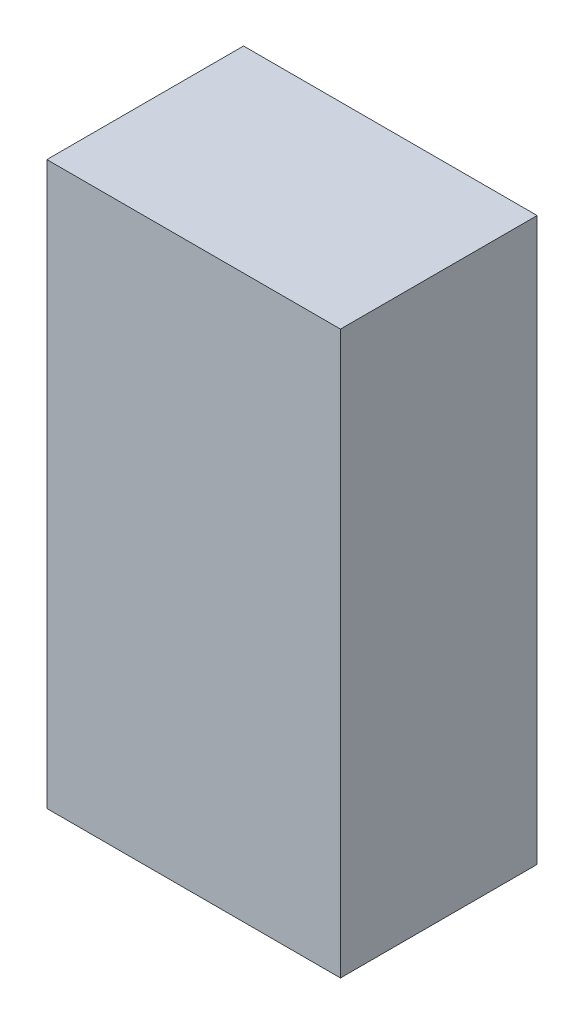
ISO-10303-21;
HEADER;
FILE_DESCRIPTION(('STEP AP214'),'2;1');
FILE_NAME('part.step','',(''),(''),'','','');
FILE_SCHEMA(('AUTOMOTIVE_DESIGN { 1 0 10303 214 1 1 1 1 }'));
ENDSEC;
DATA;
#1=APPLICATION_CONTEXT('core data for automotive mechanical design processes');
#2=APPLICATION_PROTOCOL_DEFINITION('international standard','automotive_design',2000,#1);
#3=PRODUCT_CONTEXT('',#1,'mechanical');
#4=PRODUCT('Part','Part','',(#3));
#5=PRODUCT_RELATED_PRODUCT_CATEGORY('part','',(#4));
#6=PRODUCT_DEFINITION_FORMATION('','',#4);
#7=PRODUCT_DEFINITION_CONTEXT('part definition',#1,'design');
#8=PRODUCT_DEFINITION('design','',#6,#7);
#9=PRODUCT_DEFINITION_SHAPE('','',#8);
#10=(LENGTH_UNIT() NAMED_UNIT(*) SI_UNIT(.MILLI.,.METRE.));
#11=(NAMED_UNIT(*) PLANE_ANGLE_UNIT() SI_UNIT($,.RADIAN.));
#12=(NAMED_UNIT(*) SI_UNIT($,.STERADIAN.) SOLID_ANGLE_UNIT());
#13=UNCERTAINTY_MEASURE_WITH_UNIT(LENGTH_MEASURE(1.E-05),#10,'distance_accuracy_value','');
#14=(GEOMETRIC_REPRESENTATION_CONTEXT(3) GLOBAL_UNCERTAINTY_ASSIGNED_CONTEXT((#13)) GLOBAL_UNIT_ASSIGNED_CONTEXT((#10,
#11,#12)) REPRESENTATION_CONTEXT('',''));
#15=CARTESIAN_POINT('',(0.,0.,0.));
#16=DIRECTION('',(0.,0.,1.));
#17=DIRECTION('',(1.,0.,0.));
#18=AXIS2_PLACEMENT_3D('',#15,#16,#17);
#19=CARTESIAN_POINT('',(12.8,49.,8.575));
#20=DIRECTION('',(-1.,0.,0.));
#21=DIRECTION('',(0.,0.,1.));
#22=AXIS2_PLACEMENT_3D('',#19,#20,#21);
#23=PLANE('',#22);
#24=DIRECTION('',(0.,0.,-1.));
#25=VECTOR('',#24,1.);
#26=CARTESIAN_POINT('',(12.8,0.,8.575));
#27=LINE('',#26,#25);
#28=CARTESIAN_POINT('',(12.8,0.,8.575));
#29=VERTEX_POINT('',#28);
#30=CARTESIAN_POINT('',(12.8,0.,-8.575));
#31=VERTEX_POINT('',#30);
#32=EDGE_CURVE('E98',#29,#31,#27,.T.);
#33=ORIENTED_EDGE('',*,*,#32,.T.);
#34=DIRECTION('',(0.,-1.,0.));
#35=VECTOR('',#34,1.);
#36=CARTESIAN_POINT('',(12.8,49.,-8.575));
#37=LINE('',#36,#35);
#38=CARTESIAN_POINT('',(12.8,49.,-8.575));
#39=VERTEX_POINT('',#38);
#40=EDGE_CURVE('E11',#39,#31,#37,.T.);
#41=ORIENTED_EDGE('',*,*,#40,.F.);
#42=DIRECTION('',(0.,0.,-1.));
#43=VECTOR('',#42,1.);
#44=CARTESIAN_POINT('',(12.8,49.,8.575));
#45=LINE('',#44,#43);
#46=CARTESIAN_POINT('',(12.8,49.,8.575));
#47=VERTEX_POINT('',#46);
#48=EDGE_CURVE('E86',#47,#39,#45,.T.);
#49=ORIENTED_EDGE('',*,*,#48,.F.);
#50=DIRECTION('',(0.,-1.,0.));
#51=VECTOR('',#50,1.);
#52=CARTESIAN_POINT('',(12.8,49.,8.575));
#53=LINE('',#52,#51);
#54=EDGE_CURVE('E94',#47,#29,#53,.T.);
#55=ORIENTED_EDGE('',*,*,#54,.T.);
#56=EDGE_LOOP('',(#33,#41,#49,#55));
#57=FACE_BOUND('',#56,.T.);
#58=ADVANCED_FACE('F35',(#57),#23,.F.);
#59=CARTESIAN_POINT('',(-12.8,49.,-8.575));
#60=DIRECTION('',(0.,0.,1.));
#61=DIRECTION('',(1.,0.,0.));
#62=AXIS2_PLACEMENT_3D('',#59,#60,#61);
#63=PLANE('',#62);
#64=DIRECTION('',(-1.,0.,0.));
#65=VECTOR('',#64,1.);
#66=CARTESIAN_POINT('',(-12.8,0.,-8.575));
#67=LINE('',#66,#65);
#68=CARTESIAN_POINT('',(-12.8,0.,-8.575));
#69=VERTEX_POINT('',#68);
#70=EDGE_CURVE('E90',#31,#69,#67,.T.);
#71=ORIENTED_EDGE('',*,*,#70,.T.);
#72=DIRECTION('',(0.,-1.,0.));
#73=VECTOR('',#72,1.);
#74=CARTESIAN_POINT('',(-12.8,49.,-8.575));
#75=LINE('',#74,#73);
#76=CARTESIAN_POINT('',(-12.8,49.,-8.575));
#77=VERTEX_POINT('',#76);
#78=EDGE_CURVE('E43',#77,#69,#75,.T.);
#79=ORIENTED_EDGE('',*,*,#78,.F.);
#80=DIRECTION('',(-1.,0.,0.));
#81=VECTOR('',#80,1.);
#82=CARTESIAN_POINT('',(-12.8,49.,-8.575));
#83=LINE('',#82,#81);
#84=EDGE_CURVE('E81',#39,#77,#83,.T.);
#85=ORIENTED_EDGE('',*,*,#84,.F.);
#86=ORIENTED_EDGE('',*,*,#40,.T.);
#87=EDGE_LOOP('',(#71,#79,#85,#86));
#88=FACE_BOUND('',#87,.T.);
#89=ADVANCED_FACE('F89',(#88),#63,.F.);
#90=CARTESIAN_POINT('',(-12.8,49.,8.575));
#91=DIRECTION('',(1.,0.,0.));
#92=DIRECTION('',(0.,0.,-1.));
#93=AXIS2_PLACEMENT_3D('',#90,#91,#92);
#94=PLANE('',#93);
#95=DIRECTION('',(0.,0.,1.));
#96=VECTOR('',#95,1.);
#97=CARTESIAN_POINT('',(-12.8,0.,8.575));
#98=LINE('',#97,#96);
#99=CARTESIAN_POINT('',(-12.8,0.,8.575));
#100=VERTEX_POINT('',#99);
#101=EDGE_CURVE('E68',#69,#100,#98,.T.);
#102=ORIENTED_EDGE('',*,*,#101,.T.);
#103=DIRECTION('',(0.,-1.,0.));
#104=VECTOR('',#103,1.);
#105=CARTESIAN_POINT('',(-12.8,49.,8.575));
#106=LINE('',#105,#104);
#107=CARTESIAN_POINT('',(-12.8,49.,8.575));
#108=VERTEX_POINT('',#107);
#109=EDGE_CURVE('E91',#108,#100,#106,.T.);
#110=ORIENTED_EDGE('',*,*,#109,.F.);
#111=DIRECTION('',(0.,0.,1.));
#112=VECTOR('',#111,1.);
#113=CARTESIAN_POINT('',(-12.8,49.,8.575));
#114=LINE('',#113,#112);
#115=EDGE_CURVE('E84',#77,#108,#114,.T.);
#116=ORIENTED_EDGE('',*,*,#115,.F.);
#117=ORIENTED_EDGE('',*,*,#78,.T.);
#118=EDGE_LOOP('',(#102,#110,#116,#117));
#119=FACE_BOUND('',#118,.T.);
#120=ADVANCED_FACE('F92',(#119),#94,.F.);
#121=CARTESIAN_POINT('',(-12.8,49.,8.575));
#122=DIRECTION('',(0.,0.,-1.));
#123=DIRECTION('',(-1.,0.,0.));
#124=AXIS2_PLACEMENT_3D('',#121,#122,#123);
#125=PLANE('',#124);
#126=DIRECTION('',(1.,0.,0.));
#127=VECTOR('',#126,1.);
#128=CARTESIAN_POINT('',(-12.8,0.,8.575));
#129=LINE('',#128,#127);
#130=EDGE_CURVE('E74',#100,#29,#129,.T.);
#131=ORIENTED_EDGE('',*,*,#130,.T.);
#132=ORIENTED_EDGE('',*,*,#54,.F.);
#133=DIRECTION('',(1.,0.,0.));
#134=VECTOR('',#133,1.);
#135=CARTESIAN_POINT('',(-12.8,49.,8.575));
#136=LINE('',#135,#134);
#137=EDGE_CURVE('E51',#108,#47,#136,.T.);
#138=ORIENTED_EDGE('',*,*,#137,.F.);
#139=ORIENTED_EDGE('',*,*,#109,.T.);
#140=EDGE_LOOP('',(#131,#132,#138,#139));
#141=FACE_BOUND('',#140,.T.);
#142=ADVANCED_FACE('F105',(#141),#125,.F.);
#143=CARTESIAN_POINT('',(0.,49.,0.));
#144=DIRECTION('',(0.,-1.,0.));
#145=DIRECTION('',(0.,0.,-1.));
#146=AXIS2_PLACEMENT_3D('',#143,#144,#145);
#147=PLANE('',#146);
#148=ORIENTED_EDGE('',*,*,#48,.T.);
#149=ORIENTED_EDGE('',*,*,#84,.T.);
#150=ORIENTED_EDGE('',*,*,#115,.T.);
#151=ORIENTED_EDGE('',*,*,#137,.T.);
#152=EDGE_LOOP('',(#148,#149,#150,#151));
#153=FACE_BOUND('',#152,.T.);
#154=ADVANCED_FACE('F82',(#153),#147,.F.);
#155=CARTESIAN_POINT('',(0.,0.,0.));
#156=DIRECTION('',(0.,-1.,0.));
#157=DIRECTION('',(0.,0.,-1.));
#158=AXIS2_PLACEMENT_3D('',#155,#156,#157);
#159=PLANE('',#158);
#160=ORIENTED_EDGE('',*,*,#32,.F.);
#161=ORIENTED_EDGE('',*,*,#130,.F.);
#162=ORIENTED_EDGE('',*,*,#101,.F.);
#163=ORIENTED_EDGE('',*,*,#70,.F.);
#164=EDGE_LOOP('',(#160,#161,#162,#163));
#165=FACE_BOUND('',#164,.T.);
#166=ADVANCED_FACE('F108',(#165),#159,.T.);
#167=CLOSED_SHELL('',(#58,#89,#120,#142,#154,#166));
#168=MANIFOLD_SOLID_BREP('B2',#167);
#169=ADVANCED_BREP_SHAPE_REPRESENTATION('',(#18,#168),#14);
#170=SHAPE_DEFINITION_REPRESENTATION(#9,#169);
ENDSEC;
END-ISO-10303-21;
